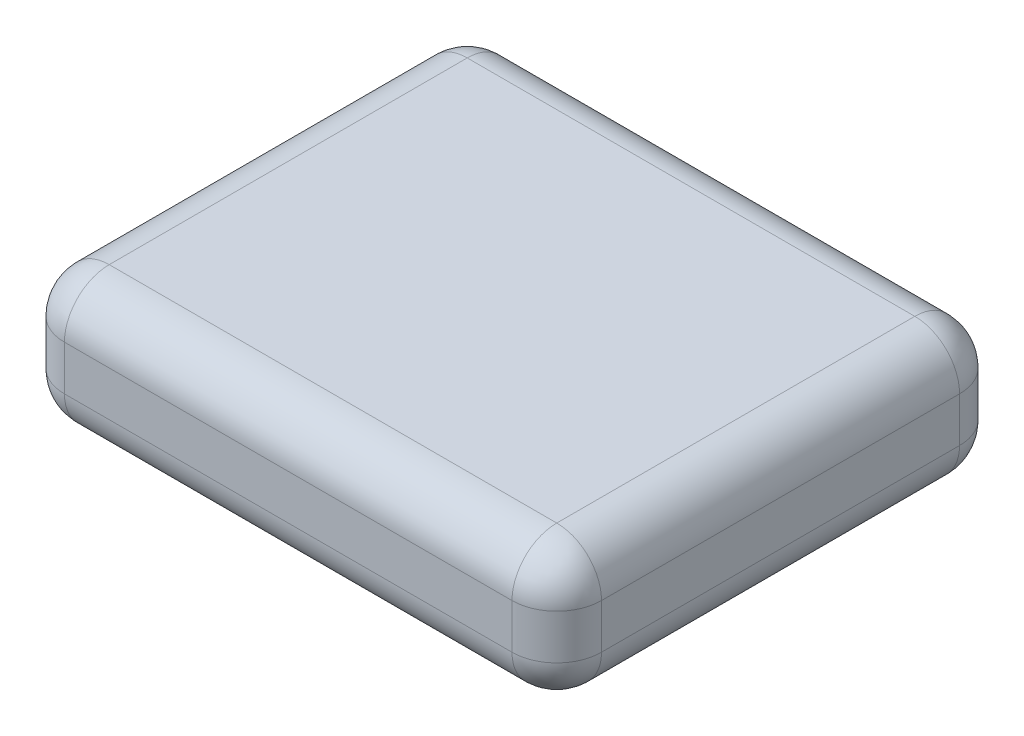
ISO-10303-21;
HEADER;
FILE_DESCRIPTION(('STEP AP214'),'2;1');
FILE_NAME('part.step','',(''),(''),'','','');
FILE_SCHEMA(('AUTOMOTIVE_DESIGN { 1 0 10303 214 1 1 1 1 }'));
ENDSEC;
DATA;
#1=APPLICATION_CONTEXT('core data for automotive mechanical design processes');
#2=APPLICATION_PROTOCOL_DEFINITION('international standard','automotive_design',2000,#1);
#3=PRODUCT_CONTEXT('',#1,'mechanical');
#4=PRODUCT('Part','Part','',(#3));
#5=PRODUCT_RELATED_PRODUCT_CATEGORY('part','',(#4));
#6=PRODUCT_DEFINITION_FORMATION('','',#4);
#7=PRODUCT_DEFINITION_CONTEXT('part definition',#1,'design');
#8=PRODUCT_DEFINITION('design','',#6,#7);
#9=PRODUCT_DEFINITION_SHAPE('','',#8);
#10=(LENGTH_UNIT() NAMED_UNIT(*) SI_UNIT(.MILLI.,.METRE.));
#11=(NAMED_UNIT(*) PLANE_ANGLE_UNIT() SI_UNIT($,.RADIAN.));
#12=(NAMED_UNIT(*) SI_UNIT($,.STERADIAN.) SOLID_ANGLE_UNIT());
#13=UNCERTAINTY_MEASURE_WITH_UNIT(LENGTH_MEASURE(1.E-05),#10,'distance_accuracy_value','');
#14=(GEOMETRIC_REPRESENTATION_CONTEXT(3) GLOBAL_UNCERTAINTY_ASSIGNED_CONTEXT((#13)) GLOBAL_UNIT_ASSIGNED_CONTEXT((#10,
#11,#12)) REPRESENTATION_CONTEXT('',''));
#15=CARTESIAN_POINT('',(0.,0.,0.));
#16=DIRECTION('',(0.,0.,1.));
#17=DIRECTION('',(1.,0.,0.));
#18=AXIS2_PLACEMENT_3D('',#15,#16,#17);
#19=CARTESIAN_POINT('',(36.,-41.5,96.));
#20=DIRECTION('',(0.,-1.,0.));
#21=DIRECTION('',(1.,0.,0.));
#22=AXIS2_PLACEMENT_3D('',#19,#20,#21);
#23=SPHERICAL_SURFACE('',#22,1.);
#24=CARTESIAN_POINT('',(36.,-41.5,96.));
#25=DIRECTION('',(0.,0.,-1.));
#26=DIRECTION('',(1.,0.,0.));
#27=AXIS2_PLACEMENT_3D('',#24,#25,#26);
#28=CIRCLE('',#27,1.);
#29=CARTESIAN_POINT('',(36.,-40.5,96.));
#30=VERTEX_POINT('',#29);
#31=CARTESIAN_POINT('',(37.,-41.5,96.));
#32=VERTEX_POINT('',#31);
#33=EDGE_CURVE('E10',#30,#32,#28,.T.);
#34=ORIENTED_EDGE('',*,*,#33,.F.);
#35=CARTESIAN_POINT('',(36.,-41.5,96.));
#36=DIRECTION('',(1.,0.,0.));
#37=DIRECTION('',(0.,0.,1.));
#38=AXIS2_PLACEMENT_3D('',#35,#36,#37);
#39=CIRCLE('',#38,1.);
#40=CARTESIAN_POINT('',(36.,-41.5,97.));
#41=VERTEX_POINT('',#40);
#42=EDGE_CURVE('E201',#30,#41,#39,.T.);
#43=ORIENTED_EDGE('',*,*,#42,.T.);
#44=CARTESIAN_POINT('',(36.,-41.5,96.));
#45=DIRECTION('',(0.,-1.,0.));
#46=DIRECTION('',(1.,0.,0.));
#47=AXIS2_PLACEMENT_3D('',#44,#45,#46);
#48=CIRCLE('',#47,1.);
#49=EDGE_CURVE('E229',#32,#41,#48,.T.);
#50=ORIENTED_EDGE('',*,*,#49,.F.);
#51=EDGE_LOOP('',(#34,#43,#50));
#52=FACE_BOUND('',#51,.T.);
#53=ADVANCED_FACE('F16',(#52),#23,.T.);
#54=CARTESIAN_POINT('',(36.,-41.5,88.));
#55=DIRECTION('',(0.,0.,1.));
#56=DIRECTION('',(1.,0.,0.));
#57=AXIS2_PLACEMENT_3D('',#54,#55,#56);
#58=SPHERICAL_SURFACE('',#57,1.);
#59=CARTESIAN_POINT('',(36.,-41.5,88.));
#60=DIRECTION('',(0.,-1.,0.));
#61=DIRECTION('',(1.,0.,0.));
#62=AXIS2_PLACEMENT_3D('',#59,#60,#61);
#63=CIRCLE('',#62,1.);
#64=CARTESIAN_POINT('',(36.,-41.5,87.));
#65=VERTEX_POINT('',#64);
#66=CARTESIAN_POINT('',(37.,-41.5,88.));
#67=VERTEX_POINT('',#66);
#68=EDGE_CURVE('E279',#65,#67,#63,.T.);
#69=ORIENTED_EDGE('',*,*,#68,.F.);
#70=CARTESIAN_POINT('',(36.,-41.5,88.));
#71=DIRECTION('',(1.,0.,0.));
#72=DIRECTION('',(0.,1.,0.));
#73=AXIS2_PLACEMENT_3D('',#70,#71,#72);
#74=CIRCLE('',#73,1.);
#75=CARTESIAN_POINT('',(36.,-40.5,88.));
#76=VERTEX_POINT('',#75);
#77=EDGE_CURVE('E308',#65,#76,#74,.T.);
#78=ORIENTED_EDGE('',*,*,#77,.T.);
#79=CARTESIAN_POINT('',(36.,-41.5,88.));
#80=DIRECTION('',(0.,0.,1.));
#81=DIRECTION('',(1.,0.,0.));
#82=AXIS2_PLACEMENT_3D('',#79,#80,#81);
#83=CIRCLE('',#82,1.);
#84=EDGE_CURVE('E24',#67,#76,#83,.T.);
#85=ORIENTED_EDGE('',*,*,#84,.F.);
#86=EDGE_LOOP('',(#69,#78,#85));
#87=FACE_BOUND('',#86,.T.);
#88=ADVANCED_FACE('F327',(#87),#58,.T.);
#89=CARTESIAN_POINT('',(37.,-43.5,87.));
#90=DIRECTION('',(1.,0.,0.));
#91=DIRECTION('',(0.,1.,0.));
#92=AXIS2_PLACEMENT_3D('',#89,#90,#91);
#93=PLANE('',#92);
#94=DIRECTION('',(0.,0.,1.));
#95=VECTOR('',#94,1.);
#96=CARTESIAN_POINT('',(37.,-42.5,87.));
#97=LINE('',#96,#95);
#98=CARTESIAN_POINT('',(37.,-42.5,88.));
#99=VERTEX_POINT('',#98);
#100=CARTESIAN_POINT('',(37.,-42.5,96.));
#101=VERTEX_POINT('',#100);
#102=EDGE_CURVE('E300',#99,#101,#97,.T.);
#103=ORIENTED_EDGE('',*,*,#102,.F.);
#104=DIRECTION('',(0.,1.,0.));
#105=VECTOR('',#104,1.);
#106=CARTESIAN_POINT('',(37.,-43.5,88.));
#107=LINE('',#106,#105);
#108=EDGE_CURVE('E206',#99,#67,#107,.T.);
#109=ORIENTED_EDGE('',*,*,#108,.T.);
#110=DIRECTION('',(0.,0.,1.));
#111=VECTOR('',#110,1.);
#112=CARTESIAN_POINT('',(37.,-41.5,87.));
#113=LINE('',#112,#111);
#114=EDGE_CURVE('E304',#67,#32,#113,.T.);
#115=ORIENTED_EDGE('',*,*,#114,.T.);
#116=DIRECTION('',(0.,1.,0.));
#117=VECTOR('',#116,1.);
#118=CARTESIAN_POINT('',(37.,-43.5,96.));
#119=LINE('',#118,#117);
#120=EDGE_CURVE('E205',#101,#32,#119,.T.);
#121=ORIENTED_EDGE('',*,*,#120,.F.);
#122=EDGE_LOOP('',(#103,#109,#115,#121));
#123=FACE_BOUND('',#122,.T.);
#124=ADVANCED_FACE('F355',(#123),#93,.T.);
#125=CARTESIAN_POINT('',(36.,-42.5,96.));
#126=DIRECTION('',(0.,0.,-1.));
#127=DIRECTION('',(1.,0.,0.));
#128=AXIS2_PLACEMENT_3D('',#125,#126,#127);
#129=SPHERICAL_SURFACE('',#128,1.);
#130=CARTESIAN_POINT('',(36.,-42.5,96.));
#131=DIRECTION('',(0.,1.,0.));
#132=DIRECTION('',(1.,0.,0.));
#133=AXIS2_PLACEMENT_3D('',#130,#131,#132);
#134=CIRCLE('',#133,1.);
#135=CARTESIAN_POINT('',(36.,-42.5,97.));
#136=VERTEX_POINT('',#135);
#137=EDGE_CURVE('E301',#136,#101,#134,.T.);
#138=ORIENTED_EDGE('',*,*,#137,.F.);
#139=CARTESIAN_POINT('',(36.,-42.5,96.));
#140=DIRECTION('',(1.,0.,0.));
#141=DIRECTION('',(0.,-1.,0.));
#142=AXIS2_PLACEMENT_3D('',#139,#140,#141);
#143=CIRCLE('',#142,1.);
#144=CARTESIAN_POINT('',(36.,-43.5,96.));
#145=VERTEX_POINT('',#144);
#146=EDGE_CURVE('E291',#136,#145,#143,.T.);
#147=ORIENTED_EDGE('',*,*,#146,.T.);
#148=CARTESIAN_POINT('',(36.,-42.5,96.));
#149=DIRECTION('',(0.,0.,-1.));
#150=DIRECTION('',(1.,0.,0.));
#151=AXIS2_PLACEMENT_3D('',#148,#149,#150);
#152=CIRCLE('',#151,1.);
#153=EDGE_CURVE('E287',#101,#145,#152,.T.);
#154=ORIENTED_EDGE('',*,*,#153,.F.);
#155=EDGE_LOOP('',(#138,#147,#154));
#156=FACE_BOUND('',#155,.T.);
#157=ADVANCED_FACE('F359',(#156),#129,.T.);
#158=CARTESIAN_POINT('',(36.,-42.5,88.));
#159=DIRECTION('',(0.,0.,1.));
#160=DIRECTION('',(1.,0.,0.));
#161=AXIS2_PLACEMENT_3D('',#158,#159,#160);
#162=SPHERICAL_SURFACE('',#161,1.);
#163=CARTESIAN_POINT('',(36.,-42.5,88.));
#164=DIRECTION('',(0.,0.,-1.));
#165=DIRECTION('',(1.,0.,0.));
#166=AXIS2_PLACEMENT_3D('',#163,#164,#165);
#167=CIRCLE('',#166,1.);
#168=CARTESIAN_POINT('',(36.,-43.5,88.));
#169=VERTEX_POINT('',#168);
#170=EDGE_CURVE('E290',#99,#169,#167,.T.);
#171=ORIENTED_EDGE('',*,*,#170,.T.);
#172=CARTESIAN_POINT('',(36.,-42.5,88.));
#173=DIRECTION('',(-1.,0.,0.));
#174=DIRECTION('',(0.,-1.,0.));
#175=AXIS2_PLACEMENT_3D('',#172,#173,#174);
#176=CIRCLE('',#175,1.);
#177=CARTESIAN_POINT('',(36.,-42.5,87.));
#178=VERTEX_POINT('',#177);
#179=EDGE_CURVE('E286',#178,#169,#176,.T.);
#180=ORIENTED_EDGE('',*,*,#179,.F.);
#181=CARTESIAN_POINT('',(36.,-42.5,88.));
#182=DIRECTION('',(0.,-1.,0.));
#183=DIRECTION('',(1.,0.,0.));
#184=AXIS2_PLACEMENT_3D('',#181,#182,#183);
#185=CIRCLE('',#184,1.);
#186=EDGE_CURVE('E311',#178,#99,#185,.T.);
#187=ORIENTED_EDGE('',*,*,#186,.T.);
#188=EDGE_LOOP('',(#171,#180,#187));
#189=FACE_BOUND('',#188,.T.);
#190=ADVANCED_FACE('F363',(#189),#162,.T.);
#191=CARTESIAN_POINT('',(36.,-41.5,87.));
#192=DIRECTION('',(0.,0.,1.));
#193=DIRECTION('',(1.,0.,0.));
#194=AXIS2_PLACEMENT_3D('',#191,#192,#193);
#195=CYLINDRICAL_SURFACE('',#194,1.);
#196=ORIENTED_EDGE('',*,*,#114,.F.);
#197=ORIENTED_EDGE('',*,*,#84,.T.);
#198=DIRECTION('',(0.,0.,1.));
#199=VECTOR('',#198,1.);
#200=CARTESIAN_POINT('',(36.,-40.5,87.));
#201=LINE('',#200,#199);
#202=EDGE_CURVE('E275',#76,#30,#201,.T.);
#203=ORIENTED_EDGE('',*,*,#202,.T.);
#204=ORIENTED_EDGE('',*,*,#33,.T.);
#205=EDGE_LOOP('',(#196,#197,#203,#204));
#206=FACE_BOUND('',#205,.T.);
#207=ADVANCED_FACE('F324',(#206),#195,.T.);
#208=CARTESIAN_POINT('',(36.,-43.5,96.));
#209=DIRECTION('',(0.,1.,0.));
#210=DIRECTION('',(1.,0.,0.));
#211=AXIS2_PLACEMENT_3D('',#208,#209,#210);
#212=CYLINDRICAL_SURFACE('',#211,1.);
#213=ORIENTED_EDGE('',*,*,#120,.T.);
#214=ORIENTED_EDGE('',*,*,#49,.T.);
#215=DIRECTION('',(0.,1.,0.));
#216=VECTOR('',#215,1.);
#217=CARTESIAN_POINT('',(36.,-43.5,97.));
#218=LINE('',#217,#216);
#219=EDGE_CURVE('E260',#136,#41,#218,.T.);
#220=ORIENTED_EDGE('',*,*,#219,.F.);
#221=ORIENTED_EDGE('',*,*,#137,.T.);
#222=EDGE_LOOP('',(#213,#214,#220,#221));
#223=FACE_BOUND('',#222,.T.);
#224=ADVANCED_FACE('F346',(#223),#212,.T.);
#225=CARTESIAN_POINT('',(25.,-41.5,96.));
#226=DIRECTION('',(1.,0.,0.));
#227=DIRECTION('',(0.,1.,0.));
#228=AXIS2_PLACEMENT_3D('',#225,#226,#227);
#229=CYLINDRICAL_SURFACE('',#228,1.);
#230=CARTESIAN_POINT('',(26.,-41.5,96.));
#231=DIRECTION('',(1.,0.,0.));
#232=DIRECTION('',(0.,0.,1.));
#233=AXIS2_PLACEMENT_3D('',#230,#231,#232);
#234=CIRCLE('',#233,1.);
#235=CARTESIAN_POINT('',(26.,-40.5,96.));
#236=VERTEX_POINT('',#235);
#237=CARTESIAN_POINT('',(26.,-41.5,97.));
#238=VERTEX_POINT('',#237);
#239=EDGE_CURVE('E268',#236,#238,#234,.T.);
#240=ORIENTED_EDGE('',*,*,#239,.T.);
#241=DIRECTION('',(1.,0.,0.));
#242=VECTOR('',#241,1.);
#243=CARTESIAN_POINT('',(25.,-41.5,97.));
#244=LINE('',#243,#242);
#245=EDGE_CURVE('E264',#238,#41,#244,.T.);
#246=ORIENTED_EDGE('',*,*,#245,.T.);
#247=ORIENTED_EDGE('',*,*,#42,.F.);
#248=DIRECTION('',(1.,0.,0.));
#249=VECTOR('',#248,1.);
#250=CARTESIAN_POINT('',(25.,-40.5,96.));
#251=LINE('',#250,#249);
#252=EDGE_CURVE('E271',#236,#30,#251,.T.);
#253=ORIENTED_EDGE('',*,*,#252,.F.);
#254=EDGE_LOOP('',(#240,#246,#247,#253));
#255=FACE_BOUND('',#254,.T.);
#256=ADVANCED_FACE('F338',(#255),#229,.T.);
#257=CARTESIAN_POINT('',(36.,-43.5,88.));
#258=DIRECTION('',(0.,1.,0.));
#259=DIRECTION('',(1.,0.,0.));
#260=AXIS2_PLACEMENT_3D('',#257,#258,#259);
#261=CYLINDRICAL_SURFACE('',#260,1.);
#262=ORIENTED_EDGE('',*,*,#186,.F.);
#263=DIRECTION('',(0.,1.,0.));
#264=VECTOR('',#263,1.);
#265=CARTESIAN_POINT('',(36.,-43.5,87.));
#266=LINE('',#265,#264);
#267=EDGE_CURVE('E244',#178,#65,#266,.T.);
#268=ORIENTED_EDGE('',*,*,#267,.T.);
#269=ORIENTED_EDGE('',*,*,#68,.T.);
#270=ORIENTED_EDGE('',*,*,#108,.F.);
#271=EDGE_LOOP('',(#262,#268,#269,#270));
#272=FACE_BOUND('',#271,.T.);
#273=ADVANCED_FACE('F371',(#272),#261,.T.);
#274=CARTESIAN_POINT('',(25.,-41.5,88.));
#275=DIRECTION('',(1.,0.,0.));
#276=DIRECTION('',(0.,1.,0.));
#277=AXIS2_PLACEMENT_3D('',#274,#275,#276);
#278=CYLINDRICAL_SURFACE('',#277,1.);
#279=DIRECTION('',(1.,0.,0.));
#280=VECTOR('',#279,1.);
#281=CARTESIAN_POINT('',(25.,-40.5,88.));
#282=LINE('',#281,#280);
#283=CARTESIAN_POINT('',(26.,-40.5,88.));
#284=VERTEX_POINT('',#283);
#285=EDGE_CURVE('E282',#284,#76,#282,.T.);
#286=ORIENTED_EDGE('',*,*,#285,.T.);
#287=ORIENTED_EDGE('',*,*,#77,.F.);
#288=DIRECTION('',(1.,0.,0.));
#289=VECTOR('',#288,1.);
#290=CARTESIAN_POINT('',(25.,-41.5,87.));
#291=LINE('',#290,#289);
#292=CARTESIAN_POINT('',(26.,-41.5,87.));
#293=VERTEX_POINT('',#292);
#294=EDGE_CURVE('E240',#293,#65,#291,.T.);
#295=ORIENTED_EDGE('',*,*,#294,.F.);
#296=CARTESIAN_POINT('',(26.,-41.5,88.));
#297=DIRECTION('',(1.,0.,0.));
#298=DIRECTION('',(0.,1.,0.));
#299=AXIS2_PLACEMENT_3D('',#296,#297,#298);
#300=CIRCLE('',#299,1.);
#301=EDGE_CURVE('E252',#293,#284,#300,.T.);
#302=ORIENTED_EDGE('',*,*,#301,.T.);
#303=EDGE_LOOP('',(#286,#287,#295,#302));
#304=FACE_BOUND('',#303,.T.);
#305=ADVANCED_FACE('F330',(#304),#278,.T.);
#306=CARTESIAN_POINT('',(36.,-42.5,87.));
#307=DIRECTION('',(0.,0.,1.));
#308=DIRECTION('',(1.,0.,0.));
#309=AXIS2_PLACEMENT_3D('',#306,#307,#308);
#310=CYLINDRICAL_SURFACE('',#309,1.);
#311=ORIENTED_EDGE('',*,*,#153,.T.);
#312=DIRECTION('',(0.,0.,1.));
#313=VECTOR('',#312,1.);
#314=CARTESIAN_POINT('',(36.,-43.5,87.));
#315=LINE('',#314,#313);
#316=EDGE_CURVE('E223',#169,#145,#315,.T.);
#317=ORIENTED_EDGE('',*,*,#316,.F.);
#318=ORIENTED_EDGE('',*,*,#170,.F.);
#319=ORIENTED_EDGE('',*,*,#102,.T.);
#320=EDGE_LOOP('',(#311,#317,#318,#319));
#321=FACE_BOUND('',#320,.T.);
#322=ADVANCED_FACE('F377',(#321),#310,.T.);
#323=CARTESIAN_POINT('',(25.,-42.5,96.));
#324=DIRECTION('',(1.,0.,0.));
#325=DIRECTION('',(0.,-1.,0.));
#326=AXIS2_PLACEMENT_3D('',#323,#324,#325);
#327=CYLINDRICAL_SURFACE('',#326,1.);
#328=DIRECTION('',(1.,0.,0.));
#329=VECTOR('',#328,1.);
#330=CARTESIAN_POINT('',(25.,-43.5,96.));
#331=LINE('',#330,#329);
#332=CARTESIAN_POINT('',(26.,-43.5,96.));
#333=VERTEX_POINT('',#332);
#334=EDGE_CURVE('E236',#333,#145,#331,.T.);
#335=ORIENTED_EDGE('',*,*,#334,.T.);
#336=ORIENTED_EDGE('',*,*,#146,.F.);
#337=DIRECTION('',(1.,0.,0.));
#338=VECTOR('',#337,1.);
#339=CARTESIAN_POINT('',(25.,-42.5,97.));
#340=LINE('',#339,#338);
#341=CARTESIAN_POINT('',(26.,-42.5,97.));
#342=VERTEX_POINT('',#341);
#343=EDGE_CURVE('E256',#342,#136,#340,.T.);
#344=ORIENTED_EDGE('',*,*,#343,.F.);
#345=CARTESIAN_POINT('',(26.,-42.5,96.));
#346=DIRECTION('',(1.,0.,0.));
#347=DIRECTION('',(0.,-1.,0.));
#348=AXIS2_PLACEMENT_3D('',#345,#346,#347);
#349=CIRCLE('',#348,1.);
#350=EDGE_CURVE('E139',#342,#333,#349,.T.);
#351=ORIENTED_EDGE('',*,*,#350,.T.);
#352=EDGE_LOOP('',(#335,#336,#344,#351));
#353=FACE_BOUND('',#352,.T.);
#354=ADVANCED_FACE('F380',(#353),#327,.T.);
#355=CARTESIAN_POINT('',(25.,-42.5,88.));
#356=DIRECTION('',(1.,0.,0.));
#357=DIRECTION('',(0.,-1.,0.));
#358=AXIS2_PLACEMENT_3D('',#355,#356,#357);
#359=CYLINDRICAL_SURFACE('',#358,1.);
#360=CARTESIAN_POINT('',(26.,-42.5,88.));
#361=DIRECTION('',(-1.,0.,0.));
#362=DIRECTION('',(0.,-1.,0.));
#363=AXIS2_PLACEMENT_3D('',#360,#361,#362);
#364=CIRCLE('',#363,1.);
#365=CARTESIAN_POINT('',(26.,-42.5,87.));
#366=VERTEX_POINT('',#365);
#367=CARTESIAN_POINT('',(26.,-43.5,88.));
#368=VERTEX_POINT('',#367);
#369=EDGE_CURVE('E185',#366,#368,#364,.T.);
#370=ORIENTED_EDGE('',*,*,#369,.F.);
#371=DIRECTION('',(1.,0.,0.));
#372=VECTOR('',#371,1.);
#373=CARTESIAN_POINT('',(25.,-42.5,87.));
#374=LINE('',#373,#372);
#375=EDGE_CURVE('E248',#366,#178,#374,.T.);
#376=ORIENTED_EDGE('',*,*,#375,.T.);
#377=ORIENTED_EDGE('',*,*,#179,.T.);
#378=DIRECTION('',(1.,0.,0.));
#379=VECTOR('',#378,1.);
#380=CARTESIAN_POINT('',(25.,-43.5,88.));
#381=LINE('',#380,#379);
#382=EDGE_CURVE('E214',#368,#169,#381,.T.);
#383=ORIENTED_EDGE('',*,*,#382,.F.);
#384=EDGE_LOOP('',(#370,#376,#377,#383));
#385=FACE_BOUND('',#384,.T.);
#386=ADVANCED_FACE('F384',(#385),#359,.T.);
#387=CARTESIAN_POINT('',(25.,-40.5,87.));
#388=DIRECTION('',(0.,1.,0.));
#389=DIRECTION('',(1.,0.,0.));
#390=AXIS2_PLACEMENT_3D('',#387,#388,#389);
#391=PLANE('',#390);
#392=DIRECTION('',(0.,0.,1.));
#393=VECTOR('',#392,1.);
#394=CARTESIAN_POINT('',(26.,-40.5,87.));
#395=LINE('',#394,#393);
#396=EDGE_CURVE('E193',#284,#236,#395,.T.);
#397=ORIENTED_EDGE('',*,*,#396,.T.);
#398=ORIENTED_EDGE('',*,*,#252,.T.);
#399=ORIENTED_EDGE('',*,*,#202,.F.);
#400=ORIENTED_EDGE('',*,*,#285,.F.);
#401=EDGE_LOOP('',(#397,#398,#399,#400));
#402=FACE_BOUND('',#401,.T.);
#403=ADVANCED_FACE('F332',(#402),#391,.T.);
#404=CARTESIAN_POINT('',(26.,-41.5,96.));
#405=DIRECTION('',(0.,-1.,0.));
#406=DIRECTION('',(-1.,0.,0.));
#407=AXIS2_PLACEMENT_3D('',#404,#405,#406);
#408=SPHERICAL_SURFACE('',#407,1.);
#409=CARTESIAN_POINT('',(26.,-41.5,96.));
#410=DIRECTION('',(0.,1.,0.));
#411=DIRECTION('',(-1.,0.,0.));
#412=AXIS2_PLACEMENT_3D('',#409,#410,#411);
#413=CIRCLE('',#412,1.);
#414=CARTESIAN_POINT('',(25.,-41.5,96.));
#415=VERTEX_POINT('',#414);
#416=EDGE_CURVE('E173',#415,#238,#413,.T.);
#417=ORIENTED_EDGE('',*,*,#416,.T.);
#418=ORIENTED_EDGE('',*,*,#239,.F.);
#419=CARTESIAN_POINT('',(26.,-41.5,96.));
#420=DIRECTION('',(0.,0.,1.));
#421=DIRECTION('',(-1.,0.,0.));
#422=AXIS2_PLACEMENT_3D('',#419,#420,#421);
#423=CIRCLE('',#422,1.);
#424=EDGE_CURVE('E219',#236,#415,#423,.T.);
#425=ORIENTED_EDGE('',*,*,#424,.T.);
#426=EDGE_LOOP('',(#417,#418,#425));
#427=FACE_BOUND('',#426,.T.);
#428=ADVANCED_FACE('F341',(#427),#408,.T.);
#429=CARTESIAN_POINT('',(25.,-43.5,97.));
#430=DIRECTION('',(0.,0.,1.));
#431=DIRECTION('',(1.,0.,0.));
#432=AXIS2_PLACEMENT_3D('',#429,#430,#431);
#433=PLANE('',#432);
#434=DIRECTION('',(0.,1.,0.));
#435=VECTOR('',#434,1.);
#436=CARTESIAN_POINT('',(26.,-43.5,97.));
#437=LINE('',#436,#435);
#438=EDGE_CURVE('E145',#342,#238,#437,.T.);
#439=ORIENTED_EDGE('',*,*,#438,.F.);
#440=ORIENTED_EDGE('',*,*,#343,.T.);
#441=ORIENTED_EDGE('',*,*,#219,.T.);
#442=ORIENTED_EDGE('',*,*,#245,.F.);
#443=EDGE_LOOP('',(#439,#440,#441,#442));
#444=FACE_BOUND('',#443,.T.);
#445=ADVANCED_FACE('F343',(#444),#433,.T.);
#446=CARTESIAN_POINT('',(26.,-41.5,88.));
#447=DIRECTION('',(0.,0.,1.));
#448=DIRECTION('',(-1.,0.,0.));
#449=AXIS2_PLACEMENT_3D('',#446,#447,#448);
#450=SPHERICAL_SURFACE('',#449,1.);
#451=CARTESIAN_POINT('',(26.,-41.5,88.));
#452=DIRECTION('',(0.,0.,-1.));
#453=DIRECTION('',(-1.,0.,0.));
#454=AXIS2_PLACEMENT_3D('',#451,#452,#453);
#455=CIRCLE('',#454,1.);
#456=CARTESIAN_POINT('',(25.,-41.5,88.));
#457=VERTEX_POINT('',#456);
#458=EDGE_CURVE('E190',#457,#284,#455,.T.);
#459=ORIENTED_EDGE('',*,*,#458,.T.);
#460=ORIENTED_EDGE('',*,*,#301,.F.);
#461=CARTESIAN_POINT('',(26.,-41.5,88.));
#462=DIRECTION('',(0.,1.,0.));
#463=DIRECTION('',(-1.,0.,0.));
#464=AXIS2_PLACEMENT_3D('',#461,#462,#463);
#465=CIRCLE('',#464,1.);
#466=EDGE_CURVE('E158',#293,#457,#465,.T.);
#467=ORIENTED_EDGE('',*,*,#466,.T.);
#468=EDGE_LOOP('',(#459,#460,#467));
#469=FACE_BOUND('',#468,.T.);
#470=ADVANCED_FACE('F392',(#469),#450,.T.);
#471=CARTESIAN_POINT('',(25.,-43.5,87.));
#472=DIRECTION('',(0.,0.,1.));
#473=DIRECTION('',(1.,0.,0.));
#474=AXIS2_PLACEMENT_3D('',#471,#472,#473);
#475=PLANE('',#474);
#476=ORIENTED_EDGE('',*,*,#294,.T.);
#477=ORIENTED_EDGE('',*,*,#267,.F.);
#478=ORIENTED_EDGE('',*,*,#375,.F.);
#479=DIRECTION('',(0.,1.,0.));
#480=VECTOR('',#479,1.);
#481=CARTESIAN_POINT('',(26.,-43.5,87.));
#482=LINE('',#481,#480);
#483=EDGE_CURVE('E200',#366,#293,#482,.T.);
#484=ORIENTED_EDGE('',*,*,#483,.T.);
#485=EDGE_LOOP('',(#476,#477,#478,#484));
#486=FACE_BOUND('',#485,.T.);
#487=ADVANCED_FACE('F395',(#486),#475,.F.);
#488=CARTESIAN_POINT('',(25.,-43.5,87.));
#489=DIRECTION('',(0.,1.,0.));
#490=DIRECTION('',(1.,0.,0.));
#491=AXIS2_PLACEMENT_3D('',#488,#489,#490);
#492=PLANE('',#491);
#493=ORIENTED_EDGE('',*,*,#382,.T.);
#494=ORIENTED_EDGE('',*,*,#316,.T.);
#495=ORIENTED_EDGE('',*,*,#334,.F.);
#496=DIRECTION('',(0.,0.,1.));
#497=VECTOR('',#496,1.);
#498=CARTESIAN_POINT('',(26.,-43.5,87.));
#499=LINE('',#498,#497);
#500=EDGE_CURVE('E156',#368,#333,#499,.T.);
#501=ORIENTED_EDGE('',*,*,#500,.F.);
#502=EDGE_LOOP('',(#493,#494,#495,#501));
#503=FACE_BOUND('',#502,.T.);
#504=ADVANCED_FACE('F399',(#503),#492,.F.);
#505=CARTESIAN_POINT('',(26.,-42.5,96.));
#506=DIRECTION('',(0.,0.,-1.));
#507=DIRECTION('',(-1.,0.,0.));
#508=AXIS2_PLACEMENT_3D('',#505,#506,#507);
#509=SPHERICAL_SURFACE('',#508,1.);
#510=CARTESIAN_POINT('',(26.,-42.5,96.));
#511=DIRECTION('',(0.,0.,1.));
#512=DIRECTION('',(-1.,0.,0.));
#513=AXIS2_PLACEMENT_3D('',#510,#511,#512);
#514=CIRCLE('',#513,1.);
#515=CARTESIAN_POINT('',(25.,-42.5,96.));
#516=VERTEX_POINT('',#515);
#517=EDGE_CURVE('E136',#516,#333,#514,.T.);
#518=ORIENTED_EDGE('',*,*,#517,.T.);
#519=ORIENTED_EDGE('',*,*,#350,.F.);
#520=CARTESIAN_POINT('',(26.,-42.5,96.));
#521=DIRECTION('',(0.,-1.,0.));
#522=DIRECTION('',(-1.,0.,0.));
#523=AXIS2_PLACEMENT_3D('',#520,#521,#522);
#524=CIRCLE('',#523,1.);
#525=EDGE_CURVE('E133',#342,#516,#524,.T.);
#526=ORIENTED_EDGE('',*,*,#525,.T.);
#527=EDGE_LOOP('',(#518,#519,#526));
#528=FACE_BOUND('',#527,.T.);
#529=ADVANCED_FACE('F135',(#528),#509,.T.);
#530=CARTESIAN_POINT('',(26.,-42.5,88.));
#531=DIRECTION('',(0.,0.,1.));
#532=DIRECTION('',(-1.,0.,0.));
#533=AXIS2_PLACEMENT_3D('',#530,#531,#532);
#534=SPHERICAL_SURFACE('',#533,1.);
#535=CARTESIAN_POINT('',(26.,-42.5,88.));
#536=DIRECTION('',(0.,1.,0.));
#537=DIRECTION('',(-1.,0.,0.));
#538=AXIS2_PLACEMENT_3D('',#535,#536,#537);
#539=CIRCLE('',#538,1.);
#540=CARTESIAN_POINT('',(25.,-42.5,88.));
#541=VERTEX_POINT('',#540);
#542=EDGE_CURVE('E146',#366,#541,#539,.T.);
#543=ORIENTED_EDGE('',*,*,#542,.F.);
#544=ORIENTED_EDGE('',*,*,#369,.T.);
#545=CARTESIAN_POINT('',(26.,-42.5,88.));
#546=DIRECTION('',(0.,0.,1.));
#547=DIRECTION('',(-1.,0.,0.));
#548=AXIS2_PLACEMENT_3D('',#545,#546,#547);
#549=CIRCLE('',#548,1.);
#550=EDGE_CURVE('E168',#541,#368,#549,.T.);
#551=ORIENTED_EDGE('',*,*,#550,.F.);
#552=EDGE_LOOP('',(#543,#544,#551));
#553=FACE_BOUND('',#552,.T.);
#554=ADVANCED_FACE('F411',(#553),#534,.T.);
#555=CARTESIAN_POINT('',(26.,-41.5,87.));
#556=DIRECTION('',(0.,0.,1.));
#557=DIRECTION('',(-1.,0.,0.));
#558=AXIS2_PLACEMENT_3D('',#555,#556,#557);
#559=CYLINDRICAL_SURFACE('',#558,1.);
#560=ORIENTED_EDGE('',*,*,#424,.F.);
#561=ORIENTED_EDGE('',*,*,#396,.F.);
#562=ORIENTED_EDGE('',*,*,#458,.F.);
#563=DIRECTION('',(0.,0.,1.));
#564=VECTOR('',#563,1.);
#565=CARTESIAN_POINT('',(25.,-41.5,87.));
#566=LINE('',#565,#564);
#567=EDGE_CURVE('E176',#457,#415,#566,.T.);
#568=ORIENTED_EDGE('',*,*,#567,.T.);
#569=EDGE_LOOP('',(#560,#561,#562,#568));
#570=FACE_BOUND('',#569,.T.);
#571=ADVANCED_FACE('F414',(#570),#559,.T.);
#572=CARTESIAN_POINT('',(26.,-43.5,96.));
#573=DIRECTION('',(0.,1.,0.));
#574=DIRECTION('',(-1.,0.,0.));
#575=AXIS2_PLACEMENT_3D('',#572,#573,#574);
#576=CYLINDRICAL_SURFACE('',#575,1.);
#577=ORIENTED_EDGE('',*,*,#525,.F.);
#578=ORIENTED_EDGE('',*,*,#438,.T.);
#579=ORIENTED_EDGE('',*,*,#416,.F.);
#580=DIRECTION('',(0.,1.,0.));
#581=VECTOR('',#580,1.);
#582=CARTESIAN_POINT('',(25.,-43.5,96.));
#583=LINE('',#582,#581);
#584=EDGE_CURVE('E164',#516,#415,#583,.T.);
#585=ORIENTED_EDGE('',*,*,#584,.F.);
#586=EDGE_LOOP('',(#577,#578,#579,#585));
#587=FACE_BOUND('',#586,.T.);
#588=ADVANCED_FACE('F171',(#587),#576,.T.);
#589=CARTESIAN_POINT('',(26.,-43.5,88.));
#590=DIRECTION('',(0.,1.,0.));
#591=DIRECTION('',(-1.,0.,0.));
#592=AXIS2_PLACEMENT_3D('',#589,#590,#591);
#593=CYLINDRICAL_SURFACE('',#592,1.);
#594=DIRECTION('',(0.,1.,0.));
#595=VECTOR('',#594,1.);
#596=CARTESIAN_POINT('',(25.,-43.5,88.));
#597=LINE('',#596,#595);
#598=EDGE_CURVE('E166',#541,#457,#597,.T.);
#599=ORIENTED_EDGE('',*,*,#598,.T.);
#600=ORIENTED_EDGE('',*,*,#466,.F.);
#601=ORIENTED_EDGE('',*,*,#483,.F.);
#602=ORIENTED_EDGE('',*,*,#542,.T.);
#603=EDGE_LOOP('',(#599,#600,#601,#602));
#604=FACE_BOUND('',#603,.T.);
#605=ADVANCED_FACE('F418',(#604),#593,.T.);
#606=CARTESIAN_POINT('',(26.,-42.5,87.));
#607=DIRECTION('',(0.,0.,1.));
#608=DIRECTION('',(-1.,0.,0.));
#609=AXIS2_PLACEMENT_3D('',#606,#607,#608);
#610=CYLINDRICAL_SURFACE('',#609,1.);
#611=DIRECTION('',(0.,0.,1.));
#612=VECTOR('',#611,1.);
#613=CARTESIAN_POINT('',(25.,-42.5,87.));
#614=LINE('',#613,#612);
#615=EDGE_CURVE('E153',#541,#516,#614,.T.);
#616=ORIENTED_EDGE('',*,*,#615,.F.);
#617=ORIENTED_EDGE('',*,*,#550,.T.);
#618=ORIENTED_EDGE('',*,*,#500,.T.);
#619=ORIENTED_EDGE('',*,*,#517,.F.);
#620=EDGE_LOOP('',(#616,#617,#618,#619));
#621=FACE_BOUND('',#620,.T.);
#622=ADVANCED_FACE('F151',(#621),#610,.T.);
#623=CARTESIAN_POINT('',(25.,-43.5,87.));
#624=DIRECTION('',(1.,0.,0.));
#625=DIRECTION('',(0.,1.,0.));
#626=AXIS2_PLACEMENT_3D('',#623,#624,#625);
#627=PLANE('',#626);
#628=ORIENTED_EDGE('',*,*,#584,.T.);
#629=ORIENTED_EDGE('',*,*,#567,.F.);
#630=ORIENTED_EDGE('',*,*,#598,.F.);
#631=ORIENTED_EDGE('',*,*,#615,.T.);
#632=EDGE_LOOP('',(#628,#629,#630,#631));
#633=FACE_BOUND('',#632,.T.);
#634=ADVANCED_FACE('F162',(#633),#627,.F.);
#635=CLOSED_SHELL('',(#53,#88,#124,#157,#190,#207,#224,#256,#273,#305,#322,#354,#386,#403,#428,
#445,#470,#487,#504,#529,#554,#571,#588,#605,#622,#634));
#636=MANIFOLD_SOLID_BREP('B1',#635);
#637=ADVANCED_BREP_SHAPE_REPRESENTATION('',(#18,#636),#14);
#638=SHAPE_DEFINITION_REPRESENTATION(#9,#637);
ENDSEC;
END-ISO-10303-21;
